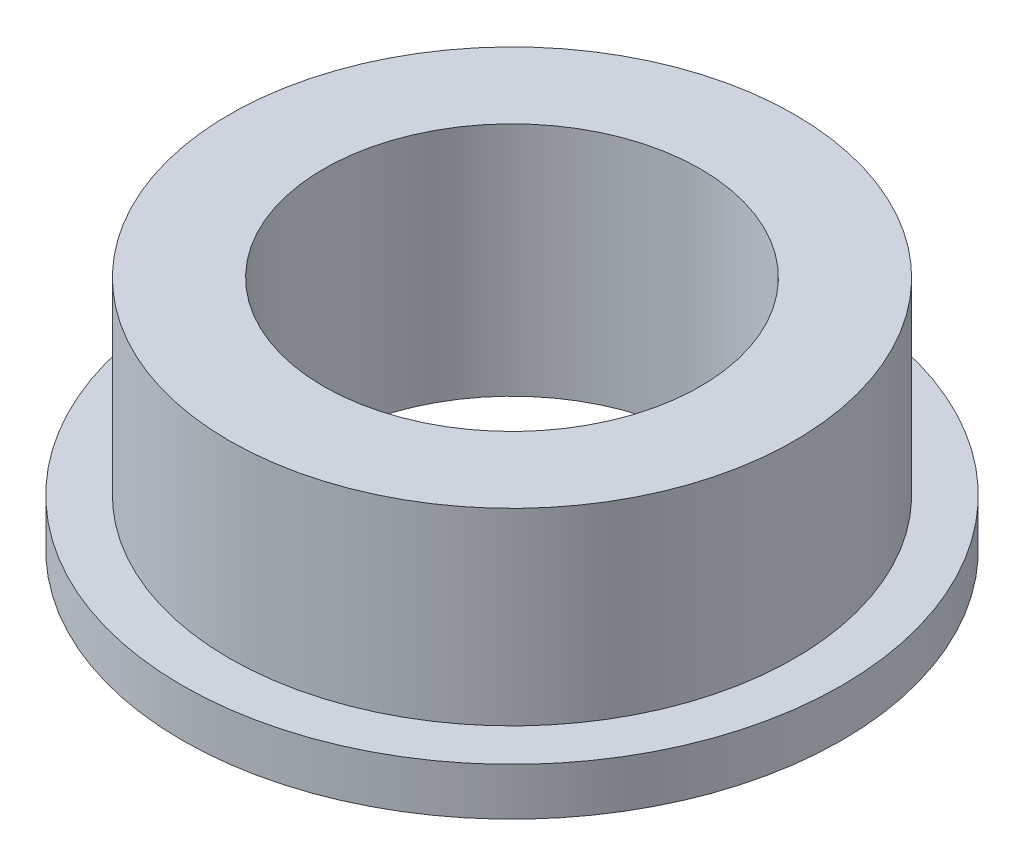
ISO-10303-21;
HEADER;
FILE_DESCRIPTION(('STEP AP214'),'2;1');
FILE_NAME('part.step','',(''),(''),'','','');
FILE_SCHEMA(('AUTOMOTIVE_DESIGN { 1 0 10303 214 1 1 1 1 }'));
ENDSEC;
DATA;
#1=APPLICATION_CONTEXT('core data for automotive mechanical design processes');
#2=APPLICATION_PROTOCOL_DEFINITION('international standard','automotive_design',2000,#1);
#3=PRODUCT_CONTEXT('',#1,'mechanical');
#4=PRODUCT('Part','Part','',(#3));
#5=PRODUCT_RELATED_PRODUCT_CATEGORY('part','',(#4));
#6=PRODUCT_DEFINITION_FORMATION('','',#4);
#7=PRODUCT_DEFINITION_CONTEXT('part definition',#1,'design');
#8=PRODUCT_DEFINITION('design','',#6,#7);
#9=PRODUCT_DEFINITION_SHAPE('','',#8);
#10=(LENGTH_UNIT() NAMED_UNIT(*) SI_UNIT(.MILLI.,.METRE.));
#11=(NAMED_UNIT(*) PLANE_ANGLE_UNIT() SI_UNIT($,.RADIAN.));
#12=(NAMED_UNIT(*) SI_UNIT($,.STERADIAN.) SOLID_ANGLE_UNIT());
#13=UNCERTAINTY_MEASURE_WITH_UNIT(LENGTH_MEASURE(1.E-05),#10,'distance_accuracy_value','');
#14=(GEOMETRIC_REPRESENTATION_CONTEXT(3) GLOBAL_UNCERTAINTY_ASSIGNED_CONTEXT((#13)) GLOBAL_UNIT_ASSIGNED_CONTEXT((#10,
#11,#12)) REPRESENTATION_CONTEXT('',''));
#15=CARTESIAN_POINT('',(0.,0.,0.));
#16=DIRECTION('',(0.,0.,1.));
#17=DIRECTION('',(1.,0.,0.));
#18=AXIS2_PLACEMENT_3D('',#15,#16,#17);
#19=CARTESIAN_POINT('',(0.,1.6002,0.));
#20=DIRECTION('',(0.,1.,0.));
#21=DIRECTION('',(0.,0.,1.));
#22=AXIS2_PLACEMENT_3D('',#19,#20,#21);
#23=PLANE('',#22);
#24=CARTESIAN_POINT('',(0.,1.6002,0.));
#25=DIRECTION('',(0.,1.,0.));
#26=DIRECTION('',(0.,0.,1.));
#27=AXIS2_PLACEMENT_3D('',#24,#25,#26);
#28=CIRCLE('',#27,9.52500000000001);
#29=CARTESIAN_POINT('',(0.,1.6002,9.52500000000001));
#30=VERTEX_POINT('',#29);
#31=EDGE_CURVE('E10',#30,#30,#28,.T.);
#32=ORIENTED_EDGE('',*,*,#31,.F.);
#33=EDGE_LOOP('',(#32));
#34=FACE_BOUND('',#33,.T.);
#35=CARTESIAN_POINT('',(0.,1.6002,0.));
#36=DIRECTION('',(0.,1.,0.));
#37=DIRECTION('',(0.,0.,1.));
#38=AXIS2_PLACEMENT_3D('',#35,#36,#37);
#39=CIRCLE('',#38,11.1125);
#40=CARTESIAN_POINT('',(0.,1.6002,11.1125));
#41=VERTEX_POINT('',#40);
#42=EDGE_CURVE('E52',#41,#41,#39,.T.);
#43=ORIENTED_EDGE('',*,*,#42,.T.);
#44=EDGE_LOOP('',(#43));
#45=FACE_BOUND('',#44,.T.);
#46=ADVANCED_FACE('F43',(#34,#45),#23,.T.);
#47=CARTESIAN_POINT('',(0.,0.,0.));
#48=DIRECTION('',(0.,1.,0.));
#49=DIRECTION('',(0.,0.,1.));
#50=AXIS2_PLACEMENT_3D('',#47,#48,#49);
#51=PLANE('',#50);
#52=CARTESIAN_POINT('',(0.,0.,0.));
#53=DIRECTION('',(0.,1.,0.));
#54=DIRECTION('',(0.,0.,1.));
#55=AXIS2_PLACEMENT_3D('',#52,#53,#54);
#56=CIRCLE('',#55,11.1125);
#57=CARTESIAN_POINT('',(0.,0.,11.1125));
#58=VERTEX_POINT('',#57);
#59=EDGE_CURVE('E47',#58,#58,#56,.T.);
#60=ORIENTED_EDGE('',*,*,#59,.F.);
#61=EDGE_LOOP('',(#60));
#62=FACE_BOUND('',#61,.T.);
#63=CARTESIAN_POINT('',(0.,0.,0.));
#64=DIRECTION('',(0.,1.,0.));
#65=DIRECTION('',(0.,0.,1.));
#66=AXIS2_PLACEMENT_3D('',#63,#64,#65);
#67=CIRCLE('',#66,6.35);
#68=CARTESIAN_POINT('',(0.,0.,6.35));
#69=VERTEX_POINT('',#68);
#70=EDGE_CURVE('E62',#69,#69,#67,.T.);
#71=ORIENTED_EDGE('',*,*,#70,.T.);
#72=EDGE_LOOP('',(#71));
#73=FACE_BOUND('',#72,.T.);
#74=ADVANCED_FACE('F93',(#62,#73),#51,.F.);
#75=CARTESIAN_POINT('',(0.,1.6002,0.));
#76=DIRECTION('',(0.,-1.,0.));
#77=DIRECTION('',(0.,0.,-1.));
#78=AXIS2_PLACEMENT_3D('',#75,#76,#77);
#79=CYLINDRICAL_SURFACE('',#78,11.1125);
#80=ORIENTED_EDGE('',*,*,#42,.F.);
#81=EDGE_LOOP('',(#80));
#82=FACE_BOUND('',#81,.T.);
#83=ORIENTED_EDGE('',*,*,#59,.T.);
#84=EDGE_LOOP('',(#83));
#85=FACE_BOUND('',#84,.T.);
#86=ADVANCED_FACE('F45',(#82,#85),#79,.T.);
#87=CARTESIAN_POINT('',(0.,1.6002,0.));
#88=DIRECTION('',(0.,-1.,0.));
#89=DIRECTION('',(0.,0.,-1.));
#90=AXIS2_PLACEMENT_3D('',#87,#88,#89);
#91=CYLINDRICAL_SURFACE('',#90,6.35);
#92=ORIENTED_EDGE('',*,*,#70,.F.);
#93=EDGE_LOOP('',(#92));
#94=FACE_BOUND('',#93,.T.);
#95=CARTESIAN_POINT('',(0.,7.9502,0.));
#96=DIRECTION('',(0.,1.,0.));
#97=DIRECTION('',(0.,0.,1.));
#98=AXIS2_PLACEMENT_3D('',#95,#96,#97);
#99=CIRCLE('',#98,6.35);
#100=CARTESIAN_POINT('',(0.,7.9502,6.35));
#101=VERTEX_POINT('',#100);
#102=EDGE_CURVE('E71',#101,#101,#99,.T.);
#103=ORIENTED_EDGE('',*,*,#102,.T.);
#104=EDGE_LOOP('',(#103));
#105=FACE_BOUND('',#104,.T.);
#106=ADVANCED_FACE('F78',(#94,#105),#91,.F.);
#107=CARTESIAN_POINT('',(0.,7.9502,0.));
#108=DIRECTION('',(0.,1.,0.));
#109=DIRECTION('',(0.,0.,1.));
#110=AXIS2_PLACEMENT_3D('',#107,#108,#109);
#111=PLANE('',#110);
#112=CARTESIAN_POINT('',(0.,7.9502,0.));
#113=DIRECTION('',(0.,1.,0.));
#114=DIRECTION('',(0.,0.,1.));
#115=AXIS2_PLACEMENT_3D('',#112,#113,#114);
#116=CIRCLE('',#115,9.52500000000001);
#117=CARTESIAN_POINT('',(0.,7.9502,9.52500000000001));
#118=VERTEX_POINT('',#117);
#119=EDGE_CURVE('E60',#118,#118,#116,.T.);
#120=ORIENTED_EDGE('',*,*,#119,.T.);
#121=EDGE_LOOP('',(#120));
#122=FACE_BOUND('',#121,.T.);
#123=ORIENTED_EDGE('',*,*,#102,.F.);
#124=EDGE_LOOP('',(#123));
#125=FACE_BOUND('',#124,.T.);
#126=ADVANCED_FACE('F80',(#122,#125),#111,.T.);
#127=CARTESIAN_POINT('',(0.,7.9502,0.));
#128=DIRECTION('',(0.,-1.,0.));
#129=DIRECTION('',(0.,0.,-1.));
#130=AXIS2_PLACEMENT_3D('',#127,#128,#129);
#131=CYLINDRICAL_SURFACE('',#130,9.52500000000001);
#132=ORIENTED_EDGE('',*,*,#119,.F.);
#133=EDGE_LOOP('',(#132));
#134=FACE_BOUND('',#133,.T.);
#135=ORIENTED_EDGE('',*,*,#31,.T.);
#136=EDGE_LOOP('',(#135));
#137=FACE_BOUND('',#136,.T.);
#138=ADVANCED_FACE('F82',(#134,#137),#131,.T.);
#139=CLOSED_SHELL('',(#46,#74,#86,#106,#126,#138));
#140=MANIFOLD_SOLID_BREP('B2',#139);
#141=ADVANCED_BREP_SHAPE_REPRESENTATION('',(#18,#140),#14);
#142=SHAPE_DEFINITION_REPRESENTATION(#9,#141);
ENDSEC;
END-ISO-10303-21;
